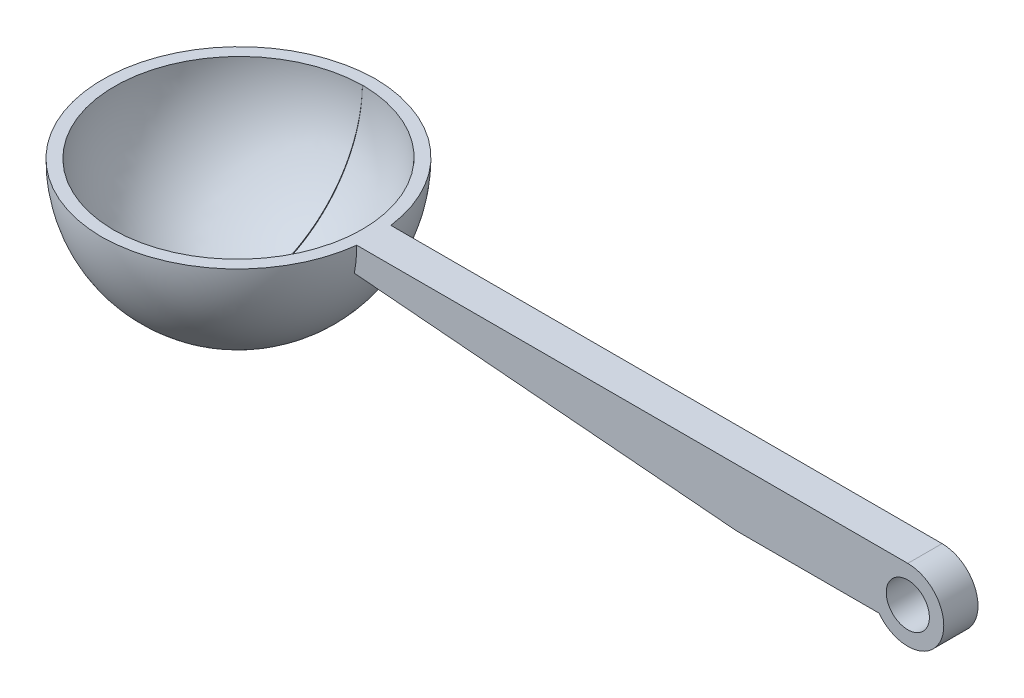
ISO-10303-21;
HEADER;
FILE_DESCRIPTION(('STEP AP214'),'2;1');
FILE_NAME('part.step','',(''),(''),'','','');
FILE_SCHEMA(('AUTOMOTIVE_DESIGN { 1 0 10303 214 1 1 1 1 }'));
ENDSEC;
DATA;
#1=APPLICATION_CONTEXT('core data for automotive mechanical design processes');
#2=APPLICATION_PROTOCOL_DEFINITION('international standard','automotive_design',2000,#1);
#3=PRODUCT_CONTEXT('',#1,'mechanical');
#4=PRODUCT('Part','Part','',(#3));
#5=PRODUCT_RELATED_PRODUCT_CATEGORY('part','',(#4));
#6=PRODUCT_DEFINITION_FORMATION('','',#4);
#7=PRODUCT_DEFINITION_CONTEXT('part definition',#1,'design');
#8=PRODUCT_DEFINITION('design','',#6,#7);
#9=PRODUCT_DEFINITION_SHAPE('','',#8);
#10=(LENGTH_UNIT() NAMED_UNIT(*) SI_UNIT(.MILLI.,.METRE.));
#11=(NAMED_UNIT(*) PLANE_ANGLE_UNIT() SI_UNIT($,.RADIAN.));
#12=(NAMED_UNIT(*) SI_UNIT($,.STERADIAN.) SOLID_ANGLE_UNIT());
#13=UNCERTAINTY_MEASURE_WITH_UNIT(LENGTH_MEASURE(1.E-05),#10,'distance_accuracy_value','');
#14=(GEOMETRIC_REPRESENTATION_CONTEXT(3) GLOBAL_UNCERTAINTY_ASSIGNED_CONTEXT((#13)) GLOBAL_UNIT_ASSIGNED_CONTEXT((#10,
#11,#12)) REPRESENTATION_CONTEXT('',''));
#15=CARTESIAN_POINT('',(0.,0.,0.));
#16=DIRECTION('',(0.,0.,1.));
#17=DIRECTION('',(1.,0.,0.));
#18=AXIS2_PLACEMENT_3D('',#15,#16,#17);
#19=CARTESIAN_POINT('',(-0.0500000000000836,10.5499999999999,50.));
#20=DIRECTION('',(0.,-1.,0.));
#21=DIRECTION('',(1.,0.,0.));
#22=AXIS2_PLACEMENT_3D('',#19,#20,#21);
#23=PLANE('',#22);
#24=DIRECTION('',(-1.,0.,0.));
#25=VECTOR('',#24,1.);
#26=CARTESIAN_POINT('',(-0.0500000000000836,10.5499999999999,40.));
#27=LINE('',#26,#25);
#28=CARTESIAN_POINT('',(-0.0500000000000827,10.5499999999999,40.));
#29=VERTEX_POINT('',#28);
#30=CARTESIAN_POINT('',(-161.049575962662,10.5500000000007,40.));
#31=VERTEX_POINT('',#30);
#32=EDGE_CURVE('E139',#29,#31,#27,.T.);
#33=ORIENTED_EDGE('',*,*,#32,.T.);
#34=CARTESIAN_POINT('',(-200.713310216771,10.5500000000006,45.1757303851178));
#35=DIRECTION('',(0.,-1.,0.));
#36=DIRECTION('',(1.,0.,0.));
#37=AXIS2_PLACEMENT_3D('',#34,#35,#36);
#38=CIRCLE('',#37,40.);
#39=CARTESIAN_POINT('',(-200.381655108386,10.5500000000006,5.17710534763575));
#40=VERTEX_POINT('',#39);
#41=EDGE_CURVE('E174',#40,#31,#38,.T.);
#42=ORIENTED_EDGE('',*,*,#41,.F.);
#43=CARTESIAN_POINT('',(-200.05,10.5500000000006,45.1757303851178));
#44=DIRECTION('',(0.,1.,0.));
#45=DIRECTION('',(-1.,0.,0.));
#46=AXIS2_PLACEMENT_3D('',#43,#44,#45);
#47=CIRCLE('',#46,40.);
#48=CARTESIAN_POINT('',(-200.381655108386,10.5500000000006,85.1743554225998));
#49=VERTEX_POINT('',#48);
#50=EDGE_CURVE('E274',#40,#49,#47,.T.);
#51=ORIENTED_EDGE('',*,*,#50,.T.);
#52=CARTESIAN_POINT('',(-161.00529562673,10.5500000000007,50.));
#53=VERTEX_POINT('',#52);
#54=EDGE_CURVE('E275',#53,#49,#38,.T.);
#55=ORIENTED_EDGE('',*,*,#54,.F.);
#56=DIRECTION('',(-1.,0.,0.));
#57=VECTOR('',#56,1.);
#58=CARTESIAN_POINT('',(-0.0500000000000836,10.5499999999999,50.));
#59=LINE('',#58,#57);
#60=CARTESIAN_POINT('',(-0.0500000000000827,10.5499999999999,50.));
#61=VERTEX_POINT('',#60);
#62=EDGE_CURVE('E124',#61,#53,#59,.T.);
#63=ORIENTED_EDGE('',*,*,#62,.F.);
#64=DIRECTION('',(0.,0.,-1.));
#65=VECTOR('',#64,1.);
#66=CARTESIAN_POINT('',(-0.0500000000000827,10.5499999999999,50.));
#67=LINE('',#66,#65);
#68=EDGE_CURVE('E112',#61,#29,#67,.T.);
#69=ORIENTED_EDGE('',*,*,#68,.T.);
#70=EDGE_LOOP('',(#33,#42,#51,#55,#63,#69));
#71=FACE_BOUND('',#70,.T.);
#72=CARTESIAN_POINT('',(-200.06484227201,10.5500000000006,45.1757303851178));
#73=DIRECTION('',(0.,1.,0.));
#74=DIRECTION('',(-1.,0.,0.));
#75=AXIS2_PLACEMENT_3D('',#72,#73,#74);
#76=CIRCLE('',#75,36.5);
#77=CARTESIAN_POINT('',(-200.381655108386,10.5500000000006,8.67710534763575));
#78=VERTEX_POINT('',#77);
#79=CARTESIAN_POINT('',(-200.698467944761,10.5500000000006,8.68123054600732));
#80=VERTEX_POINT('',#79);
#81=EDGE_CURVE('E264',#78,#80,#76,.T.);
#82=ORIENTED_EDGE('',*,*,#81,.F.);
#83=CARTESIAN_POINT('',(-200.698467944761,10.5500000000006,45.1757303851178));
#84=DIRECTION('',(0.,-1.,0.));
#85=DIRECTION('',(1.,0.,0.));
#86=AXIS2_PLACEMENT_3D('',#83,#84,#85);
#87=CIRCLE('',#86,36.5);
#88=CARTESIAN_POINT('',(-200.698467944761,10.5500000000006,81.6757303851177));
#89=VERTEX_POINT('',#88);
#90=EDGE_CURVE('E255',#78,#89,#87,.T.);
#91=ORIENTED_EDGE('',*,*,#90,.T.);
#92=DIRECTION('',(0.,0.,1.));
#93=VECTOR('',#92,1.);
#94=CARTESIAN_POINT('',(-200.698467944761,10.5500000000006,0.));
#95=LINE('',#94,#93);
#96=CARTESIAN_POINT('',(-200.698467944761,10.5500000000006,81.6702302242282));
#97=VERTEX_POINT('',#96);
#98=EDGE_CURVE('E259',#97,#89,#95,.T.);
#99=ORIENTED_EDGE('',*,*,#98,.F.);
#100=EDGE_CURVE('E258',#80,#97,#76,.T.);
#101=ORIENTED_EDGE('',*,*,#100,.F.);
#102=EDGE_LOOP('',(#82,#91,#99,#101));
#103=FACE_BOUND('',#102,.T.);
#104=ADVANCED_FACE('F40',(#71,#103),#23,.F.);
#105=CARTESIAN_POINT('',(-200.381655108386,10.5500000000006,45.1757303851178));
#106=DIRECTION('',(0.,0.,-1.));
#107=DIRECTION('',(-1.,0.,0.));
#108=AXIS2_PLACEMENT_3D('',#105,#106,#107);
#109=DEGENERATE_TOROIDAL_SURFACE('',#108,0.316812836375274,36.5,.F.);
#110=CARTESIAN_POINT('',(-200.698467944761,-25.6318001617466,45.1757303851178));
#111=CARTESIAN_POINT('',(-200.698467944761,-25.6317940307121,46.2011668921538));
#112=CARTESIAN_POINT('',(-200.698467944761,-25.5885503406625,47.2267624630136));
#113=CARTESIAN_POINT('',(-200.698467944761,-25.4158497321381,49.2708028712732));
#114=CARTESIAN_POINT('',(-200.698467944761,-25.2863745137331,50.289246144452));
#115=CARTESIAN_POINT('',(-200.698467944761,-24.9419695366922,52.3125152869155));
#116=CARTESIAN_POINT('',(-200.698467944761,-24.7269655269314,53.3173285375355));
#117=CARTESIAN_POINT('',(-200.698467944761,-24.213046198759,55.3051985234516));
#118=CARTESIAN_POINT('',(-200.698467944761,-23.9141353811748,56.2882564226713));
#119=CARTESIAN_POINT('',(-200.698467944761,-23.2346538569903,58.2253174052198));
#120=CARTESIAN_POINT('',(-200.698467944761,-22.8541140772682,59.1793313365903));
#121=CARTESIAN_POINT('',(-200.698467944761,-22.0140078811475,61.0519198416998));
#122=CARTESIAN_POINT('',(-200.698467944761,-21.5544404160951,61.9704939449738));
#123=CARTESIAN_POINT('',(-200.698467944761,-20.5596277996417,63.7655182497123));
#124=CARTESIAN_POINT('',(-200.698467944761,-20.024394450532,64.6419749920884));
#125=CARTESIAN_POINT('',(-200.698467944761,-18.8820037103203,66.3466828852394));
#126=CARTESIAN_POINT('',(-200.698467944761,-18.2748466985307,67.1749342902062));
#127=CARTESIAN_POINT('',(-200.698467944761,-16.9928807790433,68.7774008648514));
#128=CARTESIAN_POINT('',(-200.698467944761,-16.3180675022688,69.5516125392927));
#129=CARTESIAN_POINT('',(-200.698467944761,-14.9056127522807,71.0404434281997));
#130=CARTESIAN_POINT('',(-200.698467944761,-14.1679707179477,71.7550621103317));
#131=CARTESIAN_POINT('',(-200.698467944761,-12.6350858081074,73.1196385615856));
#132=CARTESIAN_POINT('',(-200.698467944761,-11.8398412629632,73.769594455128));
#133=CARTESIAN_POINT('',(-200.698467944761,-10.1974476600874,75.0001824246881));
#134=CARTESIAN_POINT('',(-200.698467944761,-9.35030015818049,75.5808165771327));
#135=CARTESIAN_POINT('',(-200.698467944761,-7.60990762366013,76.6687789611941));
#136=CARTESIAN_POINT('',(-200.698467944761,-6.71665211847776,77.1760904386249));
#137=CARTESIAN_POINT('',(-200.698467944761,-4.89045972772832,78.1136946334816));
#138=CARTESIAN_POINT('',(-200.698467944761,-3.95751861649872,78.5439791236584));
#139=CARTESIAN_POINT('',(-200.698467944761,-2.05914765540594,79.3242235371239));
#140=CARTESIAN_POINT('',(-200.698467944761,-1.09373172552254,79.6742173854942));
#141=CARTESIAN_POINT('',(-200.698467944761,0.862981108545313,80.2915577884302));
#142=CARTESIAN_POINT('',(-200.698467944761,1.85426836869742,80.5589346760091));
#143=CARTESIAN_POINT('',(-200.698467944761,3.17039944487152,80.8550718879308));
#144=CARTESIAN_POINT('',(-200.698467944761,3.48701068850064,80.9218966944526));
#145=CARTESIAN_POINT('',(-200.698467944761,4.12190674483615,81.0471058512779));
#146=CARTESIAN_POINT('',(-200.698467944761,4.44019150374396,81.10549047121));
#147=CARTESIAN_POINT('',(-200.698467944761,5.07820802554906,81.2137743523627));
#148=CARTESIAN_POINT('',(-200.698467944761,5.3979398415397,81.2636732996051));
#149=CARTESIAN_POINT('',(-200.698467944761,6.03861282383782,81.3549481271381));
#150=CARTESIAN_POINT('',(-200.698467944761,6.35955396549843,81.3963241801845));
#151=CARTESIAN_POINT('',(-200.698467944761,7.00213349753024,81.4704891037357));
#152=CARTESIAN_POINT('',(-200.698467944761,7.32377100372765,81.503285647059));
#153=CARTESIAN_POINT('',(-200.698467944761,7.96783537026334,81.5603146777498));
#154=CARTESIAN_POINT('',(-200.698467944761,8.29026229271804,81.5845464678538));
#155=CARTESIAN_POINT('',(-200.698467944761,8.77426348981048,81.6144371862152));
#156=CARTESIAN_POINT('',(-200.698467944761,8.93564449480049,81.6233241472801));
#157=CARTESIAN_POINT('',(-200.698467944761,9.25851760648314,81.6389327275878));
#158=CARTESIAN_POINT('',(-200.698467944761,9.42000971678741,81.6456542727498));
#159=CARTESIAN_POINT('',(-200.698467944761,9.74305114132477,81.6569046163978));
#160=CARTESIAN_POINT('',(-200.698467944761,9.90460044590733,81.661433688349));
#161=CARTESIAN_POINT('',(-200.698467944761,10.1469567853817,81.6664117455739));
#162=CARTESIAN_POINT('',(-200.698467944761,10.227745691854,81.6677684954334));
#163=CARTESIAN_POINT('',(-200.698467944761,10.3893325093818,81.6696788270015));
#164=CARTESIAN_POINT('',(-200.698467944761,10.4701304201683,81.6702324283846));
#165=CARTESIAN_POINT('',(-200.698467944761,10.6738970712101,81.6702268101124));
#166=CARTESIAN_POINT('',(-200.698467944761,10.7968656025964,81.6689359608382));
#167=CARTESIAN_POINT('',(-200.698467944761,11.0427790724334,81.6648222396291));
#168=CARTESIAN_POINT('',(-200.698467944761,11.16572400918,81.6619992820142));
#169=CARTESIAN_POINT('',(-200.698467944761,11.411594957571,81.6550526929211));
#170=CARTESIAN_POINT('',(-200.698467944761,11.5345209641805,81.6509288800012));
#171=CARTESIAN_POINT('',(-200.698467944761,11.7803197639586,81.6414131547425));
#172=CARTESIAN_POINT('',(-200.698467944761,11.9031925584941,81.6360212771881));
#173=CARTESIAN_POINT('',(-200.698467944761,12.271806619833,81.6179635822915));
#174=CARTESIAN_POINT('',(-200.698467944761,12.5174585538742,81.6034181318229));
#175=CARTESIAN_POINT('',(-200.698467944761,13.0083937468314,81.5693514341265));
#176=CARTESIAN_POINT('',(-200.698467944761,13.2536770356686,81.5498306154098));
#177=CARTESIAN_POINT('',(-200.698467944761,13.7440071336127,81.5058081666291));
#178=CARTESIAN_POINT('',(-200.698467944761,13.9890535642106,81.4813023148271));
#179=CARTESIAN_POINT('',(-200.698467944761,14.4786072940455,81.4273322439647));
#180=CARTESIAN_POINT('',(-200.698467944761,14.7231145757408,81.3978678659161));
#181=CARTESIAN_POINT('',(-200.698467944761,15.2114281806173,81.3340014914087));
#182=CARTESIAN_POINT('',(-200.698467944761,15.4552346500646,81.2996006151897));
#183=CARTESIAN_POINT('',(-200.698467944761,15.9420948543138,81.2258724891145));
#184=CARTESIAN_POINT('',(-200.698467944761,16.1851485971858,81.1865452922627));
#185=CARTESIAN_POINT('',(-200.698467944761,16.9141715364728,81.0610013669312));
#186=CARTESIAN_POINT('',(-200.698467944761,17.3988862650635,80.9673682531011));
#187=CARTESIAN_POINT('',(-200.698467944761,18.3641422315808,80.7605140358714));
#188=CARTESIAN_POINT('',(-200.698467944761,18.8446831133209,80.6472912776538));
#189=CARTESIAN_POINT('',(-200.698467944761,19.800543566408,80.4015057326662));
#190=CARTESIAN_POINT('',(-200.698467944761,20.2758656892084,80.2689528945958));
#191=CARTESIAN_POINT('',(-200.698467944761,21.2207018678298,79.9847039933621));
#192=CARTESIAN_POINT('',(-200.698467944761,21.6902160854948,79.8330084649574));
#193=CARTESIAN_POINT('',(-200.698467944761,23.0999220075156,79.345748002995));
#194=CARTESIAN_POINT('',(-200.698467944761,24.0301746398816,78.9808595832057));
#195=CARTESIAN_POINT('',(-200.698467944761,25.8576968746964,78.1760290079759));
#196=CARTESIAN_POINT('',(-200.698467944761,26.7549599885972,77.736072182668));
#197=CARTESIAN_POINT('',(-200.698467944761,28.5094882534497,76.7845799995265));
#198=CARTESIAN_POINT('',(-200.698467944761,29.3667953599904,76.2731220869022));
#199=CARTESIAN_POINT('',(-200.698467944761,31.0365898061385,75.1817527592435));
#200=CARTESIAN_POINT('',(-200.698467944761,31.8490793832843,74.6018447661618));
#201=CARTESIAN_POINT('',(-200.698467944761,33.4463339579674,73.3599521395424));
#202=CARTESIAN_POINT('',(-200.698467944761,34.2296461242935,72.6960975419308));
#203=CARTESIAN_POINT('',(-200.698467944761,35.7376023671765,71.3047506432001));
#204=CARTESIAN_POINT('',(-200.698467944761,36.4622439178525,70.5772556050417));
#205=CARTESIAN_POINT('',(-200.698467944761,37.847983639802,69.063486021566));
#206=CARTESIAN_POINT('',(-200.698467944761,38.5090539484616,68.2771859686032));
#207=CARTESIAN_POINT('',(-200.698467944761,39.7625811276014,66.6516894736272));
#208=CARTESIAN_POINT('',(-200.698467944761,40.3550387976438,65.8124936481994));
#209=CARTESIAN_POINT('',(-200.698467944761,41.4670530683948,64.0872952099327));
#210=CARTESIAN_POINT('',(-200.698467944761,41.9866205934477,63.2012996386208));
#211=CARTESIAN_POINT('',(-200.698467944761,42.9492669187054,61.3886833435935));
#212=CARTESIAN_POINT('',(-200.698467944761,43.3923454953677,60.4620625011586));
#213=CARTESIAN_POINT('',(-200.698467944761,44.198808646091,58.574910772765));
#214=CARTESIAN_POINT('',(-200.698467944761,44.5622036795443,57.6143843565466));
#215=CARTESIAN_POINT('',(-200.698467944761,45.2067902487137,55.6661350610779));
#216=CARTESIAN_POINT('',(-200.698467944761,45.4879818556907,54.6784122054045));
#217=CARTESIAN_POINT('',(-200.698467944761,45.966174501606,52.6827430124909));
#218=CARTESIAN_POINT('',(-200.698467944761,46.163171542352,51.6747957172208));
#219=CARTESIAN_POINT('',(-200.698467944761,46.4715552631376,49.645888498299));
#220=CARTESIAN_POINT('',(-200.698467944761,46.5829419180969,48.6249285708351));
#221=CARTESIAN_POINT('',(-200.698467944761,46.7193154842112,46.577215859496));
#222=CARTESIAN_POINT('',(-200.698467944761,46.7442991383606,45.5504628587091));
#223=CARTESIAN_POINT('',(-200.698467944761,46.7076799840927,43.4985021300706));
#224=CARTESIAN_POINT('',(-200.698467944761,46.6460771798064,42.4732944021453));
#225=CARTESIAN_POINT('',(-200.698467944761,46.4367243455551,40.4317252360841));
#226=CARTESIAN_POINT('',(-200.698467944761,46.2889753433901,39.4153636925523));
#227=CARTESIAN_POINT('',(-200.698467944761,45.9083813341838,37.3987002969734));
#228=CARTESIAN_POINT('',(-200.698467944761,45.6755363261332,36.3983984451169));
#229=CARTESIAN_POINT('',(-200.698467944761,45.1264094109576,34.4209794007151));
#230=CARTESIAN_POINT('',(-200.698467944761,44.8101286255926,33.4438618966582));
#231=CARTESIAN_POINT('',(-200.698467944761,44.0963772778209,31.5197443613036));
#232=CARTESIAN_POINT('',(-200.698467944761,43.698906724956,30.5727443264662));
#233=CARTESIAN_POINT('',(-200.698467944761,42.8255921436891,28.7155740980744));
#234=CARTESIAN_POINT('',(-200.698467944761,42.3497464259382,27.8054046989179));
#235=CARTESIAN_POINT('',(-200.698467944761,41.3230702656081,26.0283877890617));
#236=CARTESIAN_POINT('',(-200.698467944761,40.772239780223,25.161540303093));
#237=CARTESIAN_POINT('',(-200.698467944761,39.5995278910172,23.477355513343));
#238=CARTESIAN_POINT('',(-200.698467944761,38.9776485666027,22.6600167616465));
#239=CARTESIAN_POINT('',(-200.698467944761,37.6672477697375,21.0806340644386));
#240=CARTESIAN_POINT('',(-200.698467944761,36.9787264606644,20.3185899833762));
#241=CARTESIAN_POINT('',(-200.698467944761,35.5400418937808,18.8553186047514));
#242=CARTESIAN_POINT('',(-200.698467944761,34.7898875109431,18.1540825808024));
#243=CARTESIAN_POINT('',(-200.698467944761,33.2331635190937,16.817277085047));
#244=CARTESIAN_POINT('',(-200.698467944761,32.426593382775,16.1817082271561));
#245=CARTESIAN_POINT('',(-200.698467944761,30.762551093477,14.9805864244995));
#246=CARTESIAN_POINT('',(-200.698467944761,29.9050625688403,14.4150561813878));
#247=CARTESIAN_POINT('',(-200.698467944761,28.1453865145313,13.3582218158484));
#248=CARTESIAN_POINT('',(-200.698467944761,27.2432005958953,12.8669150207523));
#249=CARTESIAN_POINT('',(-200.698467944761,25.8612188102053,12.1882151222357));
#250=CARTESIAN_POINT('',(-200.698467944761,25.3955523298203,11.9716051691368));
#251=CARTESIAN_POINT('',(-200.698467944761,24.4555037126275,11.5582262277664));
#252=CARTESIAN_POINT('',(-200.698467944761,23.9811222833183,11.3614556372331));
#253=CARTESIAN_POINT('',(-200.698467944761,23.0244670907583,10.9881024770859));
#254=CARTESIAN_POINT('',(-200.698467944761,22.5421931158448,10.8115204499076));
#255=CARTESIAN_POINT('',(-200.698467944761,21.570502128442,10.4788154129789));
#256=CARTESIAN_POINT('',(-200.698467944761,21.0810829524902,10.3226987488724));
#257=CARTESIAN_POINT('',(-200.698467944761,19.6054488200331,9.88610688027796));
#258=CARTESIAN_POINT('',(-200.698467944761,18.6098860680617,9.63662094921705));
#259=CARTESIAN_POINT('',(-200.698467944761,16.6015139785798,9.22242961525131));
#260=CARTESIAN_POINT('',(-200.698467944761,15.5887094416372,9.05770099997256));
#261=CARTESIAN_POINT('',(-200.698467944761,14.2373674447831,8.89597388451137));
#262=CARTESIAN_POINT('',(-200.698467944761,13.9031247928191,8.86065236345643));
#263=CARTESIAN_POINT('',(-200.698467944761,13.2338160421734,8.79926806202008));
#264=CARTESIAN_POINT('',(-200.698467944761,12.8987500523261,8.77320411790577));
#265=CARTESIAN_POINT('',(-200.698467944761,12.2281680652717,8.73036674491173));
#266=CARTESIAN_POINT('',(-200.698467944761,11.892652327952,8.71358927045315));
#267=CARTESIAN_POINT('',(-200.698467944761,11.473054442156,8.69853076076256));
#268=CARTESIAN_POINT('',(-200.698467944761,11.3891197670219,8.6958145947372));
#269=CARTESIAN_POINT('',(-200.698467944761,11.2212321595055,8.69099534417664));
#270=CARTESIAN_POINT('',(-200.698467944761,11.1372792270889,8.68889226079877));
#271=CARTESIAN_POINT('',(-200.698467944761,10.9693615291475,8.68533664318154));
#272=CARTESIAN_POINT('',(-200.698467944761,10.88539676394,8.68388409394948));
#273=CARTESIAN_POINT('',(-200.698467944761,10.7174567278699,8.68183096491773));
#274=CARTESIAN_POINT('',(-200.698467944761,10.6334814572184,8.6812303701184));
#275=CARTESIAN_POINT('',(-200.698467944761,10.4264064546154,8.68123082031211));
#276=CARTESIAN_POINT('',(-200.698467944761,10.3033068810727,8.68252209123706));
#277=CARTESIAN_POINT('',(-200.698467944761,10.0571318249801,8.6866398540343));
#278=CARTESIAN_POINT('',(-200.698467944761,9.93405634403832,8.68946642667137));
#279=CARTESIAN_POINT('',(-200.698467944761,9.68792391917161,8.69642292350153));
#280=CARTESIAN_POINT('',(-200.698467944761,9.56486698042414,8.70055303425542));
#281=CARTESIAN_POINT('',(-200.698467944761,9.31880634090618,8.7100840179968));
#282=CARTESIAN_POINT('',(-200.698467944761,9.19580263881078,8.71548485729209));
#283=CARTESIAN_POINT('',(-200.698467944761,8.82678321749953,8.73357404115221));
#284=CARTESIAN_POINT('',(-200.698467944761,8.58085708765131,8.7481462532141));
#285=CARTESIAN_POINT('',(-200.698467944761,8.08937552311547,8.78227749599777));
#286=CARTESIAN_POINT('',(-200.698467944761,7.84382005707173,8.80183607800849));
#287=CARTESIAN_POINT('',(-200.698467944761,7.35289032448434,8.84595017886098));
#288=CARTESIAN_POINT('',(-200.698467944761,7.10751654033159,8.8705110735274));
#289=CARTESIAN_POINT('',(-200.698467944761,6.61730961918171,8.92460455949762));
#290=CARTESIAN_POINT('',(-200.698467944761,6.37247650082414,8.95413731957796));
#291=CARTESIAN_POINT('',(-200.698467944761,5.88352111211884,9.01815270604327));
#292=CARTESIAN_POINT('',(-200.698467944761,5.63939867527585,9.05263405854626));
#293=CARTESIAN_POINT('',(-200.698467944761,5.15190947445782,9.12653596336583));
#294=CARTESIAN_POINT('',(-200.698467944761,4.90854270185811,9.16595645909628));
#295=CARTESIAN_POINT('',(-200.698467944761,4.17814174619545,9.29187614109901));
#296=CARTESIAN_POINT('',(-200.698467944761,3.69236968039192,9.38582900056374));
#297=CARTESIAN_POINT('',(-200.698467944761,2.72501708829162,9.59341009665394));
#298=CARTESIAN_POINT('',(-200.698467944761,2.24343697343337,9.70704024223058));
#299=CARTESIAN_POINT('',(-200.698467944761,1.28558307761187,9.95371123938842));
#300=CARTESIAN_POINT('',(-200.698467944761,0.809306155003197,10.0867398595794));
#301=CARTESIAN_POINT('',(-200.698467944761,-0.137404071410876,10.3720183727495));
#302=CARTESIAN_POINT('',(-200.698467944761,-0.607837566107257,10.5242676360122));
#303=CARTESIAN_POINT('',(-200.698467944761,-2.01843467454685,11.0126842648492));
#304=CARTESIAN_POINT('',(-200.698467944761,-2.94865216430172,11.378143126911));
#305=CARTESIAN_POINT('',(-200.698467944761,-4.77608762771899,12.184138889793));
#306=CARTESIAN_POINT('',(-200.698467944761,-5.67329778590074,12.6246934344317));
#307=CARTESIAN_POINT('',(-200.698467944761,-7.42732024107096,13.5772034284796));
#308=CARTESIAN_POINT('',(-200.698467944761,-8.28418976666882,14.0890533851592));
#309=CARTESIAN_POINT('',(-200.698467944761,-9.95307474559451,15.1811501135787));
#310=CARTESIAN_POINT('',(-200.698467944761,-10.7650930871423,15.7613924735883));
#311=CARTESIAN_POINT('',(-200.698467944761,-12.3614031601079,17.0039325033444));
#312=CARTESIAN_POINT('',(-200.698467944761,-13.14423980109,17.6681009627122));
#313=CARTESIAN_POINT('',(-200.698467944761,-14.6512355035954,19.060030254162));
#314=CARTESIAN_POINT('',(-200.698467944761,-15.3753915877213,19.7877943091369));
#315=CARTESIAN_POINT('',(-200.698467944761,-16.7603610103145,21.3022837620945));
#316=CARTESIAN_POINT('',(-200.698467944761,-17.4211269301412,22.0890525263502));
#317=CARTESIAN_POINT('',(-200.698467944761,-18.6739869174828,23.7154559756469));
#318=CARTESIAN_POINT('',(-200.698467944761,-19.2660827440576,24.5550893056534));
#319=CARTESIAN_POINT('',(-200.698467944761,-20.377509693741,26.2814195127702));
#320=CARTESIAN_POINT('',(-200.698467944761,-20.8968277791417,27.168124783415));
#321=CARTESIAN_POINT('',(-200.698467944761,-21.858906085296,28.9822096708819));
#322=CARTESIAN_POINT('',(-200.698467944761,-22.301661964662,29.9095915904995));
#323=CARTESIAN_POINT('',(-200.698467944761,-23.1069993500927,31.7973584890329));
#324=CARTESIAN_POINT('',(-200.698467944761,-23.4696647237504,32.7577077161505));
#325=CARTESIAN_POINT('',(-200.698467944761,-24.112786928229,34.7054101866235));
#326=CARTESIAN_POINT('',(-200.698467944761,-24.3932612623362,35.6927576314396));
#327=CARTESIAN_POINT('',(-200.698467944761,-24.7975799380585,37.3841041073889));
#328=CARTESIAN_POINT('',(-200.698467944761,-24.9431197823567,38.0830012223928));
#329=CARTESIAN_POINT('',(-200.698467944761,-25.1930063203014,39.4882511289843));
#330=CARTESIAN_POINT('',(-200.698467944761,-25.297347809089,40.1946048510476));
#331=CARTESIAN_POINT('',(-200.698467944761,-25.4644373410226,41.6122442705906));
#332=CARTESIAN_POINT('',(-200.698467944761,-25.5271836729804,42.3235301697596));
#333=CARTESIAN_POINT('',(-200.698467944761,-25.6108645780306,43.7484286944015));
#334=CARTESIAN_POINT('',(-200.698467944761,-25.6318044288602,44.4620410147878));
#335=CARTESIAN_POINT('',(-200.698467944761,-25.6318001617466,45.1757303851178));
#336=B_SPLINE_CURVE_WITH_KNOTS('',3,(#110,#111,#112,#113,#114,#115,#116,#117,#118,#119,#120,
#121,#122,#123,#124,#125,#126,#127,#128,#129,#130,#131,#132,#133,#134,#135,#136,#137,#138,#139,
#140,#141,#142,#143,#144,#145,#146,#147,#148,#149,#150,#151,#152,#153,#154,#155,#156,#157,#158,
#159,#160,#161,#162,#163,#164,#165,#166,#167,#168,#169,#170,#171,#172,#173,#174,#175,#176,#177,
#178,#179,#180,#181,#182,#183,#184,#185,#186,#187,#188,#189,#190,#191,#192,#193,#194,#195,#196,
#197,#198,#199,#200,#201,#202,#203,#204,#205,#206,#207,#208,#209,#210,#211,#212,#213,#214,#215,
#216,#217,#218,#219,#220,#221,#222,#223,#224,#225,#226,#227,#228,#229,#230,#231,#232,#233,#234,
#235,#236,#237,#238,#239,#240,#241,#242,#243,#244,#245,#246,#247,#248,#249,#250,#251,#252,#253,
#254,#255,#256,#257,#258,#259,#260,#261,#262,#263,#264,#265,#266,#267,#268,#269,#270,#271,#272,
#273,#274,#275,#276,#277,#278,#279,#280,#281,#282,#283,#284,#285,#286,#287,#288,#289,#290,#291,
#292,#293,#294,#295,#296,#297,#298,#299,#300,#301,#302,#303,#304,#305,#306,#307,#308,#309,#310,
#311,#312,#313,#314,#315,#316,#317,#318,#319,#320,#321,#322,#323,#324,#325,#326,#327,#328,#329,
#330,#331,#332,#333,#334,#335),.UNSPECIFIED.,.T.,.F.,(4,2,2,2,2,2,2,2,2,2,2,2,2,2,2,2,2,2,2,2,2,
2,2,2,2,2,2,2,2,2,2,2,2,2,2,2,2,2,2,2,2,2,2,2,2,2,2,2,2,2,2,2,2,2,2,2,2,2,2,2,2,2,2,2,2,2,2,2,2,
2,2,2,2,2,2,2,2,2,2,2,2,2,2,2,2,2,2,2,2,2,2,2,2,2,2,2,2,2,2,2,2,2,2,2,2,2,2,2,2,2,2,2,4),(0.,
3.07567512846728,6.15200318032974,9.23100777023243,12.3098472314482,15.3875222622948,
18.4652381353416,21.5424744778311,24.6196945922515,27.6971135542024,30.7745600032539,
33.8520956893105,36.9295391693444,40.0076847353483,43.0861588820367,46.1633298801259,
49.2393697414289,50.2100601894686,51.1807196211718,52.1514149604152,53.1220906221081,
54.0918951992269,55.0617787107484,55.546643266258,56.0315244076256,56.5163450545962,
56.7587437564394,57.0011365202417,57.3700424674737,57.7389690471471,58.1079471069838,
58.4769150465128,59.2151060135677,59.9532334242612,60.6919885643143,61.4307673960226,
62.1693788409669,62.9079823395449,64.3885638962062,65.8692705848027,67.3492178635398,
68.8291238085157,71.8232208656965,74.8179037008364,77.8093676705563,80.8006821544609,
83.8773596009961,86.9541694339668,90.032321712451,93.1104381167523,96.1880926971784,
99.265756272044,102.343015625595,105.420272311507,108.497675112518,111.575078815082,
114.652598520702,117.730118079502,120.807600921542,123.885083800085,126.962525305235,
130.03996644871,133.11747393402,136.194983176167,139.272402371057,142.349814021622,
145.426783308438,148.503781358918,151.581774162576,154.659656106169,156.200022877043,
157.740265145369,159.280548787909,160.821308898353,163.896502193202,166.970852840052,
167.979078930095,168.987178235183,169.994838023241,170.246772725717,170.498707903773,
170.750637275239,171.002562211137,171.371861142772,171.741179503312,172.110550744234,
172.479912192721,173.218928867926,173.957879064316,174.697627617149,175.437401286789,
176.17698486205,176.91655996492,178.400434930013,179.88445393089,181.36754122186,
182.850579935775,185.845202944506,188.840530515669,191.831472203424,194.822221062538,
197.898421077615,200.974777078637,204.05341667322,207.131977387642,210.211088905194,
213.290374963646,216.366421063233,219.441811615599,221.582350079265,223.723158884752,
225.864055755768,228.004682338412),.UNSPECIFIED.);
#337=EDGE_CURVE('E11',#80,#97,#336,.T.);
#338=ORIENTED_EDGE('',*,*,#337,.F.);
#339=ORIENTED_EDGE('',*,*,#100,.T.);
#340=EDGE_LOOP('',(#338,#339));
#341=FACE_BOUND('',#340,.T.);
#342=ADVANCED_FACE('F182',(#341),#109,.T.);
#343=CARTESIAN_POINT('',(-0.92582021258019,-10.3764311021434,50.));
#344=DIRECTION('',(-0.0837052071297888,-0.996490561068874,0.));
#345=DIRECTION('',(0.996490561068874,-0.0837052071297888,0.));
#346=AXIS2_PLACEMENT_3D('',#343,#344,#345);
#347=PLANE('',#346);
#348=DIRECTION('',(-0.996490561068874,0.0837052071297888,0.));
#349=VECTOR('',#348,1.);
#350=CARTESIAN_POINT('',(-0.92582021258019,-10.3764311021434,40.));
#351=LINE('',#350,#349);
#352=CARTESIAN_POINT('',(-0.0500000000001561,-10.4500000000001,40.));
#353=VERTEX_POINT('',#352);
#354=CARTESIAN_POINT('',(-1.80164042516023,-10.3028622042867,40.));
#355=VERTEX_POINT('',#354);
#356=EDGE_CURVE('E134',#353,#355,#351,.T.);
#357=ORIENTED_EDGE('',*,*,#356,.F.);
#358=DIRECTION('',(0.,0.,-1.));
#359=VECTOR('',#358,1.);
#360=CARTESIAN_POINT('',(-0.0500000000001561,-10.4500000000001,50.));
#361=LINE('',#360,#359);
#362=CARTESIAN_POINT('',(-0.0500000000001561,-10.4500000000001,50.));
#363=VERTEX_POINT('',#362);
#364=EDGE_CURVE('E94',#363,#353,#361,.T.);
#365=ORIENTED_EDGE('',*,*,#364,.F.);
#366=DIRECTION('',(-0.996490561068874,0.0837052071297888,0.));
#367=VECTOR('',#366,1.);
#368=CARTESIAN_POINT('',(-0.92582021258019,-10.3764311021434,50.));
#369=LINE('',#368,#367);
#370=CARTESIAN_POINT('',(-1.80164042516023,-10.3028622042867,50.));
#371=VERTEX_POINT('',#370);
#372=EDGE_CURVE('E149',#363,#371,#369,.T.);
#373=ORIENTED_EDGE('',*,*,#372,.T.);
#374=DIRECTION('',(0.,0.,-1.));
#375=VECTOR('',#374,1.);
#376=CARTESIAN_POINT('',(-1.80164042516023,-10.3028622042867,50.));
#377=LINE('',#376,#375);
#378=EDGE_CURVE('E89',#371,#355,#377,.T.);
#379=ORIENTED_EDGE('',*,*,#378,.T.);
#380=EDGE_LOOP('',(#357,#365,#373,#379));
#381=FACE_BOUND('',#380,.T.);
#382=ADVANCED_FACE('F42',(#381),#347,.T.);
#383=CARTESIAN_POINT('',(-0.0500000000001194,0.0499999999998835,50.));
#384=DIRECTION('',(0.,0.,-1.));
#385=DIRECTION('',(0.,1.,0.));
#386=AXIS2_PLACEMENT_3D('',#383,#384,#385);
#387=CYLINDRICAL_SURFACE('',#386,10.5);
#388=CARTESIAN_POINT('',(-0.0500000000001194,0.0499999999998835,40.));
#389=DIRECTION('',(0.,0.,1.));
#390=DIRECTION('',(0.,-1.,0.));
#391=AXIS2_PLACEMENT_3D('',#388,#389,#390);
#392=CIRCLE('',#391,10.5);
#393=EDGE_CURVE('E137',#353,#29,#392,.T.);
#394=ORIENTED_EDGE('',*,*,#393,.T.);
#395=ORIENTED_EDGE('',*,*,#68,.F.);
#396=CARTESIAN_POINT('',(-0.0500000000001194,0.0499999999998835,50.));
#397=DIRECTION('',(0.,0.,1.));
#398=DIRECTION('',(0.,-1.,0.));
#399=AXIS2_PLACEMENT_3D('',#396,#397,#398);
#400=CIRCLE('',#399,10.5);
#401=EDGE_CURVE('E126',#363,#61,#400,.T.);
#402=ORIENTED_EDGE('',*,*,#401,.F.);
#403=ORIENTED_EDGE('',*,*,#364,.T.);
#404=EDGE_LOOP('',(#394,#395,#402,#403));
#405=FACE_BOUND('',#404,.T.);
#406=ADVANCED_FACE('F179',(#405),#387,.T.);
#407=CARTESIAN_POINT('',(-0.92582021258019,-10.3764311021434,50.));
#408=DIRECTION('',(-0.0837052071297888,-0.996490561068874,0.));
#409=DIRECTION('',(0.996490561068874,-0.0837052071297888,0.));
#410=AXIS2_PLACEMENT_3D('',#407,#408,#409);
#411=PLANE('',#410);
#412=CARTESIAN_POINT('',(-161.755212913558,3.13323788473928,39.9998));
#413=CARTESIAN_POINT('',(-161.646622809195,3.12411631597281,40.8299216988501));
#414=CARTESIAN_POINT('',(-161.564217807436,3.11719429582503,41.6634873199622));
#415=CARTESIAN_POINT('',(-161.452171492423,3.10778240536396,43.3308707136352));
#416=CARTESIAN_POINT('',(-161.422322839151,3.10527511848914,44.1646744570326));
#417=CARTESIAN_POINT('',(-161.414922087439,3.10465345534533,45.8325156376986));
#418=CARTESIAN_POINT('',(-161.437369988991,3.10653907907566,46.6665530749671));
#419=CARTESIAN_POINT('',(-161.53461470513,3.11470763523133,48.3348717139081));
#420=CARTESIAN_POINT('',(-161.609618975982,3.12100799398293,49.1691407399931));
#421=CARTESIAN_POINT('',(-161.710837865807,3.12951038072818,50.0002));
#422=B_SPLINE_CURVE_WITH_KNOTS('',3,(#412,#413,#414,#415,#416,#417,#418,#419,#420,#421),
.UNSPECIFIED.,.F.,.F.,(4,2,2,2,4),(0.,2.51130587786207,5.01268201742582,7.51405815660141,
10.025364034073),.UNSPECIFIED.);
#423=CARTESIAN_POINT('',(-161.75518676007,3.13323568784632,40.));
#424=VERTEX_POINT('',#423);
#425=CARTESIAN_POINT('',(-161.710813515746,3.12950833532307,50.));
#426=VERTEX_POINT('',#425);
#427=EDGE_CURVE('E198',#424,#426,#422,.T.);
#428=ORIENTED_EDGE('',*,*,#427,.F.);
#429=DIRECTION('',(-0.996490561068874,0.0837052071297888,0.));
#430=VECTOR('',#429,1.);
#431=CARTESIAN_POINT('',(-0.92582021258019,-10.3764311021434,40.));
#432=LINE('',#431,#430);
#433=CARTESIAN_POINT('',(-50.0500000000001,-6.24999999999995,40.));
#434=VERTEX_POINT('',#433);
#435=EDGE_CURVE('E111',#434,#424,#432,.T.);
#436=ORIENTED_EDGE('',*,*,#435,.F.);
#437=DIRECTION('',(0.,0.,-1.));
#438=VECTOR('',#437,1.);
#439=CARTESIAN_POINT('',(-50.0500000000001,-6.24999999999995,50.));
#440=LINE('',#439,#438);
#441=CARTESIAN_POINT('',(-50.0500000000001,-6.24999999999995,50.));
#442=VERTEX_POINT('',#441);
#443=EDGE_CURVE('E104',#442,#434,#440,.T.);
#444=ORIENTED_EDGE('',*,*,#443,.F.);
#445=DIRECTION('',(-0.996490561068874,0.0837052071297888,0.));
#446=VECTOR('',#445,1.);
#447=CARTESIAN_POINT('',(-0.92582021258019,-10.3764311021434,50.));
#448=LINE('',#447,#446);
#449=EDGE_CURVE('E109',#442,#426,#448,.T.);
#450=ORIENTED_EDGE('',*,*,#449,.T.);
#451=EDGE_LOOP('',(#428,#436,#444,#450));
#452=FACE_BOUND('',#451,.T.);
#453=ADVANCED_FACE('F107',(#452),#411,.T.);
#454=CARTESIAN_POINT('',(-0.0500000000001408,-6.25000000000012,50.));
#455=DIRECTION('',(0.,1.,0.));
#456=DIRECTION('',(-1.,0.,0.));
#457=AXIS2_PLACEMENT_3D('',#454,#455,#456);
#458=PLANE('',#457);
#459=DIRECTION('',(1.,0.,0.));
#460=VECTOR('',#459,1.);
#461=CARTESIAN_POINT('',(-0.0500000000001408,-6.25000000000012,40.));
#462=LINE('',#461,#460);
#463=CARTESIAN_POINT('',(-8.45000000000014,-6.25000000000009,40.));
#464=VERTEX_POINT('',#463);
#465=EDGE_CURVE('E82',#434,#464,#462,.T.);
#466=ORIENTED_EDGE('',*,*,#465,.T.);
#467=DIRECTION('',(0.,0.,-1.));
#468=VECTOR('',#467,1.);
#469=CARTESIAN_POINT('',(-8.45000000000014,-6.25000000000009,50.));
#470=LINE('',#469,#468);
#471=CARTESIAN_POINT('',(-8.45000000000014,-6.25000000000009,50.));
#472=VERTEX_POINT('',#471);
#473=EDGE_CURVE('E113',#472,#464,#470,.T.);
#474=ORIENTED_EDGE('',*,*,#473,.F.);
#475=DIRECTION('',(1.,0.,0.));
#476=VECTOR('',#475,1.);
#477=CARTESIAN_POINT('',(-0.0500000000001408,-6.25000000000012,50.));
#478=LINE('',#477,#476);
#479=EDGE_CURVE('E115',#442,#472,#478,.T.);
#480=ORIENTED_EDGE('',*,*,#479,.F.);
#481=ORIENTED_EDGE('',*,*,#443,.T.);
#482=EDGE_LOOP('',(#466,#474,#480,#481));
#483=FACE_BOUND('',#482,.T.);
#484=ADVANCED_FACE('F116',(#483),#458,.F.);
#485=CARTESIAN_POINT('',(-0.0500000000001194,0.0499999999998835,50.));
#486=DIRECTION('',(0.,0.,-1.));
#487=DIRECTION('',(0.,1.,0.));
#488=AXIS2_PLACEMENT_3D('',#485,#486,#487);
#489=CYLINDRICAL_SURFACE('',#488,10.5);
#490=CARTESIAN_POINT('',(-0.0500000000001194,0.0499999999998835,40.));
#491=DIRECTION('',(0.,0.,1.));
#492=DIRECTION('',(0.,-1.,0.));
#493=AXIS2_PLACEMENT_3D('',#490,#491,#492);
#494=CIRCLE('',#493,10.5);
#495=EDGE_CURVE('E144',#464,#355,#494,.T.);
#496=ORIENTED_EDGE('',*,*,#495,.T.);
#497=ORIENTED_EDGE('',*,*,#378,.F.);
#498=CARTESIAN_POINT('',(-0.0500000000001194,0.0499999999998835,50.));
#499=DIRECTION('',(0.,0.,1.));
#500=DIRECTION('',(0.,-1.,0.));
#501=AXIS2_PLACEMENT_3D('',#498,#499,#500);
#502=CIRCLE('',#501,10.5);
#503=EDGE_CURVE('E62',#472,#371,#502,.T.);
#504=ORIENTED_EDGE('',*,*,#503,.F.);
#505=ORIENTED_EDGE('',*,*,#473,.T.);
#506=EDGE_LOOP('',(#496,#497,#504,#505));
#507=FACE_BOUND('',#506,.T.);
#508=ADVANCED_FACE('F221',(#507),#489,.T.);
#509=CARTESIAN_POINT('',(-0.0500000000001194,0.0499999999998835,50.));
#510=DIRECTION('',(0.,0.,-1.));
#511=DIRECTION('',(0.,1.,0.));
#512=AXIS2_PLACEMENT_3D('',#509,#510,#511);
#513=CYLINDRICAL_SURFACE('',#512,6.3);
#514=CARTESIAN_POINT('',(-0.0500000000001194,0.0499999999998835,50.));
#515=DIRECTION('',(0.,0.,1.));
#516=DIRECTION('',(0.,-1.,0.));
#517=AXIS2_PLACEMENT_3D('',#514,#515,#516);
#518=CIRCLE('',#517,6.3);
#519=CARTESIAN_POINT('',(-0.0500000000001414,-6.25000000000012,50.));
#520=VERTEX_POINT('',#519);
#521=EDGE_CURVE('E131',#520,#520,#518,.T.);
#522=ORIENTED_EDGE('',*,*,#521,.T.);
#523=EDGE_LOOP('',(#522));
#524=FACE_BOUND('',#523,.T.);
#525=CARTESIAN_POINT('',(-0.0500000000001194,0.0499999999998835,40.));
#526=DIRECTION('',(0.,0.,1.));
#527=DIRECTION('',(0.,-1.,0.));
#528=AXIS2_PLACEMENT_3D('',#525,#526,#527);
#529=CIRCLE('',#528,6.3);
#530=CARTESIAN_POINT('',(-0.0500000000001414,-6.25000000000012,40.));
#531=VERTEX_POINT('',#530);
#532=EDGE_CURVE('E146',#531,#531,#529,.T.);
#533=ORIENTED_EDGE('',*,*,#532,.F.);
#534=EDGE_LOOP('',(#533));
#535=FACE_BOUND('',#534,.T.);
#536=ADVANCED_FACE('F217',(#524,#535),#513,.F.);
#537=CARTESIAN_POINT('',(-0.0500000000001194,0.0499999999998835,50.));
#538=DIRECTION('',(0.,0.,1.));
#539=DIRECTION('',(0.,-1.,0.));
#540=AXIS2_PLACEMENT_3D('',#537,#538,#539);
#541=PLANE('',#540);
#542=CARTESIAN_POINT('',(-200.381655108386,10.5500000000006,50.));
#543=DIRECTION('',(0.,0.,1.));
#544=DIRECTION('',(1.,0.,0.));
#545=AXIS2_PLACEMENT_3D('',#542,#543,#544);
#546=CIRCLE('',#545,39.3763594816558);
#547=EDGE_CURVE('E123',#426,#53,#546,.T.);
#548=ORIENTED_EDGE('',*,*,#547,.F.);
#549=ORIENTED_EDGE('',*,*,#449,.F.);
#550=ORIENTED_EDGE('',*,*,#479,.T.);
#551=ORIENTED_EDGE('',*,*,#503,.T.);
#552=ORIENTED_EDGE('',*,*,#372,.F.);
#553=ORIENTED_EDGE('',*,*,#401,.T.);
#554=ORIENTED_EDGE('',*,*,#62,.T.);
#555=EDGE_LOOP('',(#548,#549,#550,#551,#552,#553,#554));
#556=FACE_BOUND('',#555,.T.);
#557=ORIENTED_EDGE('',*,*,#521,.F.);
#558=EDGE_LOOP('',(#557));
#559=FACE_BOUND('',#558,.T.);
#560=ADVANCED_FACE('F119',(#556,#559),#541,.T.);
#561=CARTESIAN_POINT('',(-0.0500000000001194,0.0499999999998835,40.));
#562=DIRECTION('',(0.,0.,1.));
#563=DIRECTION('',(0.,-1.,0.));
#564=AXIS2_PLACEMENT_3D('',#561,#562,#563);
#565=PLANE('',#564);
#566=ORIENTED_EDGE('',*,*,#435,.T.);
#567=CARTESIAN_POINT('',(-200.381655108386,10.5500000000006,40.));
#568=DIRECTION('',(0.,0.,1.));
#569=DIRECTION('',(1.,0.,0.));
#570=AXIS2_PLACEMENT_3D('',#567,#568,#569);
#571=CIRCLE('',#570,39.3320791457234);
#572=EDGE_CURVE('E54',#424,#31,#571,.T.);
#573=ORIENTED_EDGE('',*,*,#572,.T.);
#574=ORIENTED_EDGE('',*,*,#32,.F.);
#575=ORIENTED_EDGE('',*,*,#393,.F.);
#576=ORIENTED_EDGE('',*,*,#356,.T.);
#577=ORIENTED_EDGE('',*,*,#495,.F.);
#578=ORIENTED_EDGE('',*,*,#465,.F.);
#579=EDGE_LOOP('',(#566,#573,#574,#575,#576,#577,#578));
#580=FACE_BOUND('',#579,.T.);
#581=ORIENTED_EDGE('',*,*,#532,.T.);
#582=EDGE_LOOP('',(#581));
#583=FACE_BOUND('',#582,.T.);
#584=ADVANCED_FACE('F159',(#580,#583),#565,.F.);
#585=CARTESIAN_POINT('',(-200.05,10.5500000000006,45.1757303851178));
#586=DIRECTION('',(0.,-1.,0.));
#587=DIRECTION('',(-1.,0.,0.));
#588=AXIS2_PLACEMENT_3D('',#585,#586,#587);
#589=CIRCLE('',#588,40.);
#590=TRIMMED_CURVE('',#589,(PARAMETER_VALUE(-1.56250485408118)),
(PARAMETER_VALUE(1.56250485408118)),.T.,.PARAMETER.);
#591=CARTESIAN_POINT('',(-200.381655108386,10.5500000000006,45.1757303851178));
#592=DIRECTION('',(0.,0.,-1.));
#593=AXIS1_PLACEMENT('',#591,#592);
#594=SURFACE_OF_REVOLUTION('',#590,#593);
#595=ORIENTED_EDGE('',*,*,#427,.T.);
#596=ORIENTED_EDGE('',*,*,#547,.T.);
#597=ORIENTED_EDGE('',*,*,#54,.T.);
#598=ORIENTED_EDGE('',*,*,#50,.F.);
#599=ORIENTED_EDGE('',*,*,#41,.T.);
#600=ORIENTED_EDGE('',*,*,#572,.F.);
#601=EDGE_LOOP('',(#595,#596,#597,#598,#599,#600));
#602=FACE_BOUND('',#601,.T.);
#603=ADVANCED_FACE('F208',(#602),#594,.T.);
#604=CARTESIAN_POINT('',(-200.698467944762,-190.14846794476,0.));
#605=DIRECTION('',(1.,0.,0.));
#606=DIRECTION('',(0.,1.,0.));
#607=AXIS2_PLACEMENT_3D('',#604,#605,#606);
#608=PLANE('',#607);
#609=ORIENTED_EDGE('',*,*,#337,.T.);
#610=ORIENTED_EDGE('',*,*,#98,.T.);
#611=CARTESIAN_POINT('',(-200.698467944761,10.5500000000006,45.1757303851178));
#612=DIRECTION('',(1.,0.,0.));
#613=DIRECTION('',(0.,1.,0.));
#614=AXIS2_PLACEMENT_3D('',#611,#612,#613);
#615=CIRCLE('',#614,36.5);
#616=CARTESIAN_POINT('',(-200.698467944761,10.2331871636253,8.67710534763576));
#617=VERTEX_POINT('',#616);
#618=EDGE_CURVE('E254',#617,#89,#615,.F.);
#619=ORIENTED_EDGE('',*,*,#618,.F.);
#620=CARTESIAN_POINT('',(-200.698467944761,9.91637432725001,45.1757303851178));
#621=DIRECTION('',(1.,0.,0.));
#622=DIRECTION('',(0.,1.,0.));
#623=AXIS2_PLACEMENT_3D('',#620,#621,#622);
#624=CIRCLE('',#623,36.5);
#625=EDGE_CURVE('E262',#80,#617,#624,.F.);
#626=ORIENTED_EDGE('',*,*,#625,.F.);
#627=EDGE_LOOP('',(#609,#610,#619,#626));
#628=FACE_BOUND('',#627,.T.);
#629=ADVANCED_FACE('F212',(#628),#608,.T.);
#630=CARTESIAN_POINT('',(-200.698467944761,10.5500000000006,45.1757303851178));
#631=DIRECTION('',(0.,0.,1.));
#632=DIRECTION('',(0.,-1.,0.));
#633=AXIS2_PLACEMENT_3D('',#630,#631,#632);
#634=SPHERICAL_SURFACE('',#633,36.5);
#635=ORIENTED_EDGE('',*,*,#90,.F.);
#636=CARTESIAN_POINT('',(-200.698467944761,10.5500000000006,8.67710534763576));
#637=DIRECTION('',(0.,0.,1.));
#638=DIRECTION('',(1.,0.,0.));
#639=AXIS2_PLACEMENT_3D('',#636,#637,#638);
#640=CIRCLE('',#639,0.316812836375314);
#641=EDGE_CURVE('E250',#617,#78,#640,.T.);
#642=ORIENTED_EDGE('',*,*,#641,.F.);
#643=ORIENTED_EDGE('',*,*,#618,.T.);
#644=EDGE_LOOP('',(#635,#642,#643));
#645=FACE_BOUND('',#644,.T.);
#646=ADVANCED_FACE('F252',(#645),#634,.F.);
#647=CARTESIAN_POINT('',(-200.06484227201,10.5500000000006,45.1757303851178));
#648=DIRECTION('',(0.,-1.,0.));
#649=DIRECTION('',(1.,0.,0.));
#650=AXIS2_PLACEMENT_3D('',#647,#648,#649);
#651=CIRCLE('',#650,36.5);
#652=TRIMMED_CURVE('',#651,(PARAMETER_VALUE(-1.58815680628934)),
(PARAMETER_VALUE(1.58815680628934)),.T.,.PARAMETER.);
#653=CARTESIAN_POINT('',(-200.698467944761,10.5500000000006,45.1757303851178));
#654=DIRECTION('',(0.,0.,1.));
#655=AXIS1_PLACEMENT('',#653,#654);
#656=SURFACE_OF_REVOLUTION('',#652,#655);
#657=ORIENTED_EDGE('',*,*,#625,.T.);
#658=ORIENTED_EDGE('',*,*,#641,.T.);
#659=ORIENTED_EDGE('',*,*,#81,.T.);
#660=EDGE_LOOP('',(#657,#658,#659));
#661=FACE_BOUND('',#660,.T.);
#662=ADVANCED_FACE('F263',(#661),#656,.F.);
#663=CLOSED_SHELL('',(#104,#342,#382,#406,#453,#484,#508,#536,#560,#584,#603,#629,#646,#662));
#664=MANIFOLD_SOLID_BREP('B2',#663);
#665=ADVANCED_BREP_SHAPE_REPRESENTATION('',(#18,#664),#14);
#666=SHAPE_DEFINITION_REPRESENTATION(#9,#665);
ENDSEC;
END-ISO-10303-21;
